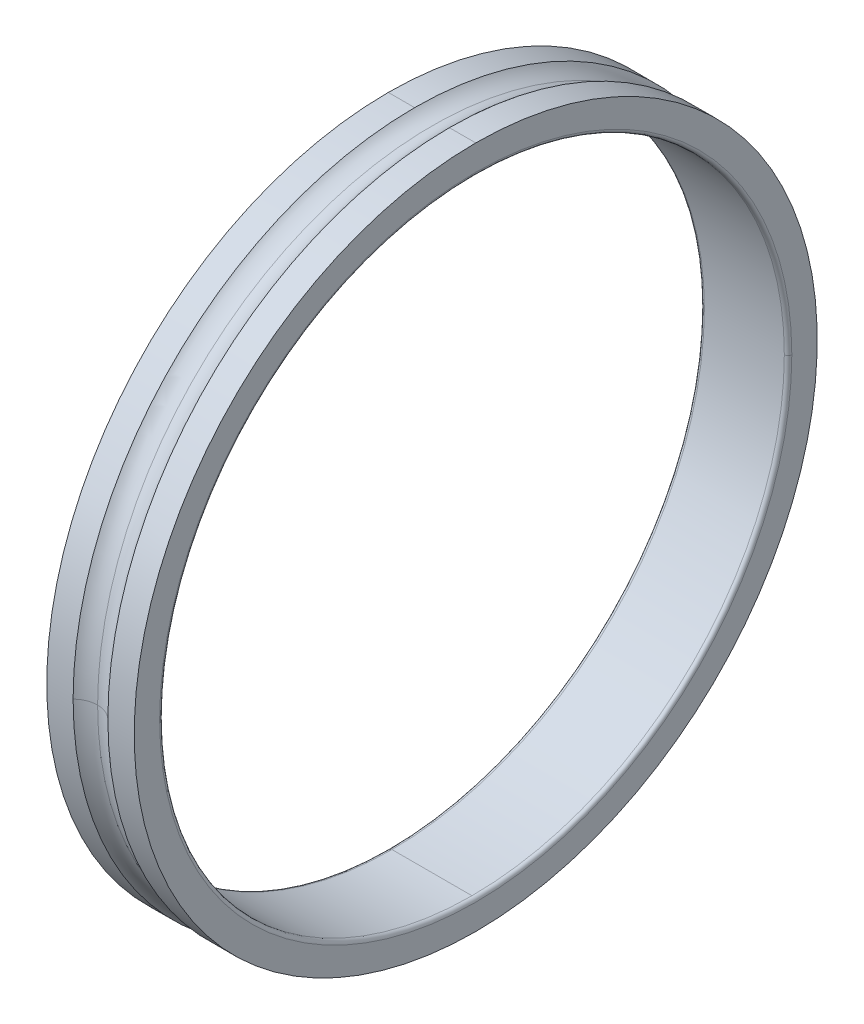
ISO-10303-21;
HEADER;
FILE_DESCRIPTION(('STEP AP214'),'2;1');
FILE_NAME('part.step','',(''),(''),'','','');
FILE_SCHEMA(('AUTOMOTIVE_DESIGN { 1 0 10303 214 1 1 1 1 }'));
ENDSEC;
DATA;
#1=APPLICATION_CONTEXT('core data for automotive mechanical design processes');
#2=APPLICATION_PROTOCOL_DEFINITION('international standard','automotive_design',2000,#1);
#3=PRODUCT_CONTEXT('',#1,'mechanical');
#4=PRODUCT('Part','Part','',(#3));
#5=PRODUCT_RELATED_PRODUCT_CATEGORY('part','',(#4));
#6=PRODUCT_DEFINITION_FORMATION('','',#4);
#7=PRODUCT_DEFINITION_CONTEXT('part definition',#1,'design');
#8=PRODUCT_DEFINITION('design','',#6,#7);
#9=PRODUCT_DEFINITION_SHAPE('','',#8);
#10=(LENGTH_UNIT() NAMED_UNIT(*) SI_UNIT(.MILLI.,.METRE.));
#11=(NAMED_UNIT(*) PLANE_ANGLE_UNIT() SI_UNIT($,.RADIAN.));
#12=(NAMED_UNIT(*) SI_UNIT($,.STERADIAN.) SOLID_ANGLE_UNIT());
#13=UNCERTAINTY_MEASURE_WITH_UNIT(LENGTH_MEASURE(1.E-05),#10,'distance_accuracy_value','');
#14=(GEOMETRIC_REPRESENTATION_CONTEXT(3) GLOBAL_UNCERTAINTY_ASSIGNED_CONTEXT((#13)) GLOBAL_UNIT_ASSIGNED_CONTEXT((#10,
#11,#12)) REPRESENTATION_CONTEXT('',''));
#15=CARTESIAN_POINT('',(0.,0.,0.));
#16=DIRECTION('',(0.,0.,1.));
#17=DIRECTION('',(1.,0.,0.));
#18=AXIS2_PLACEMENT_3D('',#15,#16,#17);
#19=CARTESIAN_POINT('',(5.94570382527338,0.,0.));
#20=DIRECTION('',(1.,0.,0.));
#21=DIRECTION('',(0.,1.,0.));
#22=AXIS2_PLACEMENT_3D('',#19,#20,#21);
#23=CYLINDRICAL_SURFACE('',#22,27.335);
#24=DIRECTION('',(1.,0.,0.));
#25=VECTOR('',#24,1.);
#26=CARTESIAN_POINT('',(5.94570382527338,27.335,0.));
#27=LINE('',#26,#25);
#28=CARTESIAN_POINT('',(4.89140765054676,27.335,0.));
#29=VERTEX_POINT('',#28);
#30=CARTESIAN_POINT('',(7.,27.335,0.));
#31=VERTEX_POINT('',#30);
#32=EDGE_CURVE('E157',#29,#31,#27,.T.);
#33=ORIENTED_EDGE('',*,*,#32,.T.);
#34=CARTESIAN_POINT('',(7.,0.,0.));
#35=DIRECTION('',(1.,0.,0.));
#36=DIRECTION('',(0.,1.,0.));
#37=AXIS2_PLACEMENT_3D('',#34,#35,#36);
#38=CIRCLE('',#37,27.335);
#39=CARTESIAN_POINT('',(7.,-27.335,0.));
#40=VERTEX_POINT('',#39);
#41=EDGE_CURVE('E169',#40,#31,#38,.T.);
#42=ORIENTED_EDGE('',*,*,#41,.F.);
#43=DIRECTION('',(-1.,0.,0.));
#44=VECTOR('',#43,1.);
#45=CARTESIAN_POINT('',(5.94570382527338,-27.335,0.));
#46=LINE('',#45,#44);
#47=CARTESIAN_POINT('',(4.89140765054676,-27.335,0.));
#48=VERTEX_POINT('',#47);
#49=EDGE_CURVE('E163',#40,#48,#46,.T.);
#50=ORIENTED_EDGE('',*,*,#49,.T.);
#51=CARTESIAN_POINT('',(4.89140765054676,0.,0.));
#52=DIRECTION('',(1.,0.,0.));
#53=DIRECTION('',(0.,1.,0.));
#54=AXIS2_PLACEMENT_3D('',#51,#52,#53);
#55=CIRCLE('',#54,27.335);
#56=CARTESIAN_POINT('',(4.89140765054676,0.,-27.335));
#57=VERTEX_POINT('',#56);
#58=EDGE_CURVE('E145',#48,#57,#55,.T.);
#59=ORIENTED_EDGE('',*,*,#58,.T.);
#60=CARTESIAN_POINT('',(4.89140765054676,0.,0.));
#61=DIRECTION('',(1.,0.,0.));
#62=DIRECTION('',(0.,1.,0.));
#63=AXIS2_PLACEMENT_3D('',#60,#61,#62);
#64=CIRCLE('',#63,27.335);
#65=EDGE_CURVE('E154',#57,#29,#64,.T.);
#66=ORIENTED_EDGE('',*,*,#65,.T.);
#67=EDGE_LOOP('',(#33,#42,#50,#59,#66));
#68=FACE_BOUND('',#67,.T.);
#69=ADVANCED_FACE('F17',(#68),#23,.T.);
#70=CARTESIAN_POINT('',(3.5,0.,0.));
#71=DIRECTION('',(1.,0.,0.));
#72=DIRECTION('',(0.,0.,-1.));
#73=AXIS2_PLACEMENT_3D('',#70,#71,#72);
#74=TOROIDAL_SURFACE('',#73,28.75,1.9845);
#75=CARTESIAN_POINT('',(3.5,0.,0.));
#76=DIRECTION('',(-1.,0.,0.));
#77=DIRECTION('',(0.,0.,1.));
#78=AXIS2_PLACEMENT_3D('',#75,#76,#77);
#79=CIRCLE('',#78,26.7655);
#80=CARTESIAN_POINT('',(3.5,0.,26.7655));
#81=VERTEX_POINT('',#80);
#82=CARTESIAN_POINT('',(3.5,0.,-26.7655));
#83=VERTEX_POINT('',#82);
#84=EDGE_CURVE('E133',#81,#83,#79,.T.);
#85=ORIENTED_EDGE('',*,*,#84,.T.);
#86=CARTESIAN_POINT('',(3.5,0.,-28.75));
#87=DIRECTION('',(0.,-1.,0.));
#88=DIRECTION('',(0.,0.,-1.));
#89=AXIS2_PLACEMENT_3D('',#86,#87,#88);
#90=CIRCLE('',#89,1.9845);
#91=CARTESIAN_POINT('',(2.10859234945325,0.,-27.335));
#92=VERTEX_POINT('',#91);
#93=EDGE_CURVE('E127',#83,#92,#90,.T.);
#94=ORIENTED_EDGE('',*,*,#93,.T.);
#95=CARTESIAN_POINT('',(2.10859234945325,0.,0.));
#96=DIRECTION('',(1.,0.,0.));
#97=DIRECTION('',(0.,1.,0.));
#98=AXIS2_PLACEMENT_3D('',#95,#96,#97);
#99=CIRCLE('',#98,27.335);
#100=CARTESIAN_POINT('',(2.10859234945325,27.335,0.));
#101=VERTEX_POINT('',#100);
#102=EDGE_CURVE('E11',#92,#101,#99,.T.);
#103=ORIENTED_EDGE('',*,*,#102,.T.);
#104=CARTESIAN_POINT('',(2.10859234945325,0.,0.));
#105=DIRECTION('',(1.,0.,0.));
#106=DIRECTION('',(0.,1.,0.));
#107=AXIS2_PLACEMENT_3D('',#104,#105,#106);
#108=CIRCLE('',#107,27.335);
#109=CARTESIAN_POINT('',(2.10859234945325,0.,27.335));
#110=VERTEX_POINT('',#109);
#111=EDGE_CURVE('E126',#101,#110,#108,.T.);
#112=ORIENTED_EDGE('',*,*,#111,.T.);
#113=CARTESIAN_POINT('',(3.5,0.,28.75));
#114=DIRECTION('',(0.,-1.,0.));
#115=DIRECTION('',(0.,0.,1.));
#116=AXIS2_PLACEMENT_3D('',#113,#114,#115);
#117=CIRCLE('',#116,1.9845);
#118=EDGE_CURVE('E174',#110,#81,#117,.T.);
#119=ORIENTED_EDGE('',*,*,#118,.T.);
#120=EDGE_LOOP('',(#85,#94,#103,#112,#119));
#121=FACE_BOUND('',#120,.T.);
#122=ADVANCED_FACE('F260',(#121),#74,.F.);
#123=CARTESIAN_POINT('',(1.05429617472663,0.,0.));
#124=DIRECTION('',(1.,0.,0.));
#125=DIRECTION('',(0.,1.,0.));
#126=AXIS2_PLACEMENT_3D('',#123,#124,#125);
#127=CYLINDRICAL_SURFACE('',#126,27.335);
#128=DIRECTION('',(1.,0.,0.));
#129=VECTOR('',#128,1.);
#130=CARTESIAN_POINT('',(1.05429617472663,27.335,0.));
#131=LINE('',#130,#129);
#132=CARTESIAN_POINT('',(0.,27.335,0.));
#133=VERTEX_POINT('',#132);
#134=EDGE_CURVE('E113',#133,#101,#131,.T.);
#135=ORIENTED_EDGE('',*,*,#134,.T.);
#136=ORIENTED_EDGE('',*,*,#102,.F.);
#137=CARTESIAN_POINT('',(2.10859234945325,0.,0.));
#138=DIRECTION('',(1.,0.,0.));
#139=DIRECTION('',(0.,1.,0.));
#140=AXIS2_PLACEMENT_3D('',#137,#138,#139);
#141=CIRCLE('',#140,27.335);
#142=CARTESIAN_POINT('',(2.10859234945325,-27.335,0.));
#143=VERTEX_POINT('',#142);
#144=EDGE_CURVE('E130',#143,#92,#141,.T.);
#145=ORIENTED_EDGE('',*,*,#144,.F.);
#146=DIRECTION('',(-1.,0.,0.));
#147=VECTOR('',#146,1.);
#148=CARTESIAN_POINT('',(1.05429617472663,-27.335,0.));
#149=LINE('',#148,#147);
#150=CARTESIAN_POINT('',(0.,-27.335,0.));
#151=VERTEX_POINT('',#150);
#152=EDGE_CURVE('E115',#143,#151,#149,.T.);
#153=ORIENTED_EDGE('',*,*,#152,.T.);
#154=CARTESIAN_POINT('',(0.,0.,0.));
#155=DIRECTION('',(1.,0.,0.));
#156=DIRECTION('',(0.,1.,0.));
#157=AXIS2_PLACEMENT_3D('',#154,#155,#156);
#158=CIRCLE('',#157,27.335);
#159=EDGE_CURVE('E24',#151,#133,#158,.T.);
#160=ORIENTED_EDGE('',*,*,#159,.T.);
#161=EDGE_LOOP('',(#135,#136,#145,#153,#160));
#162=FACE_BOUND('',#161,.T.);
#163=ADVANCED_FACE('F111',(#162),#127,.T.);
#164=CARTESIAN_POINT('',(0.,26.3175,0.));
#165=DIRECTION('',(-1.,0.,0.));
#166=DIRECTION('',(0.,0.,1.));
#167=AXIS2_PLACEMENT_3D('',#164,#165,#166);
#168=PLANE('',#167);
#169=CARTESIAN_POINT('',(0.,0.,0.));
#170=DIRECTION('',(1.,0.,0.));
#171=DIRECTION('',(0.,1.,0.));
#172=AXIS2_PLACEMENT_3D('',#169,#170,#171);
#173=CIRCLE('',#172,25.3);
#174=CARTESIAN_POINT('',(0.,0.,25.3));
#175=VERTEX_POINT('',#174);
#176=CARTESIAN_POINT('',(0.,0.,-25.3));
#177=VERTEX_POINT('',#176);
#178=EDGE_CURVE('E118',#175,#177,#173,.T.);
#179=ORIENTED_EDGE('',*,*,#178,.T.);
#180=CARTESIAN_POINT('',(0.,0.,0.));
#181=DIRECTION('',(1.,0.,0.));
#182=DIRECTION('',(0.,1.,0.));
#183=AXIS2_PLACEMENT_3D('',#180,#181,#182);
#184=CIRCLE('',#183,25.3);
#185=EDGE_CURVE('E189',#177,#175,#184,.T.);
#186=ORIENTED_EDGE('',*,*,#185,.T.);
#187=EDGE_LOOP('',(#179,#186));
#188=FACE_BOUND('',#187,.T.);
#189=CARTESIAN_POINT('',(0.,0.,0.));
#190=DIRECTION('',(1.,0.,0.));
#191=DIRECTION('',(0.,1.,0.));
#192=AXIS2_PLACEMENT_3D('',#189,#190,#191);
#193=CIRCLE('',#192,27.335);
#194=EDGE_CURVE('E119',#133,#151,#193,.T.);
#195=ORIENTED_EDGE('',*,*,#194,.F.);
#196=ORIENTED_EDGE('',*,*,#159,.F.);
#197=EDGE_LOOP('',(#195,#196));
#198=FACE_BOUND('',#197,.T.);
#199=ADVANCED_FACE('F120',(#188,#198),#168,.T.);
#200=CARTESIAN_POINT('',(0.3,0.,0.));
#201=DIRECTION('',(1.,0.,0.));
#202=DIRECTION('',(0.,0.,-1.));
#203=AXIS2_PLACEMENT_3D('',#200,#201,#202);
#204=TOROIDAL_SURFACE('',#203,25.3,0.3);
#205=CARTESIAN_POINT('',(0.3,0.,-25.3));
#206=DIRECTION('',(0.,-1.,0.));
#207=DIRECTION('',(0.,0.,-1.));
#208=AXIS2_PLACEMENT_3D('',#205,#206,#207);
#209=CIRCLE('',#208,0.3);
#210=CARTESIAN_POINT('',(0.3,0.,-25.));
#211=VERTEX_POINT('',#210);
#212=EDGE_CURVE('E141',#211,#177,#209,.T.);
#213=ORIENTED_EDGE('',*,*,#212,.T.);
#214=ORIENTED_EDGE('',*,*,#178,.F.);
#215=CARTESIAN_POINT('',(0.3,0.,25.3));
#216=DIRECTION('',(0.,-1.,0.));
#217=DIRECTION('',(0.,0.,1.));
#218=AXIS2_PLACEMENT_3D('',#215,#216,#217);
#219=CIRCLE('',#218,0.3);
#220=CARTESIAN_POINT('',(0.3,0.,25.));
#221=VERTEX_POINT('',#220);
#222=EDGE_CURVE('E151',#175,#221,#219,.T.);
#223=ORIENTED_EDGE('',*,*,#222,.T.);
#224=CARTESIAN_POINT('',(0.3,0.,0.));
#225=DIRECTION('',(1.,0.,0.));
#226=DIRECTION('',(0.,1.,0.));
#227=AXIS2_PLACEMENT_3D('',#224,#225,#226);
#228=CIRCLE('',#227,25.);
#229=CARTESIAN_POINT('',(0.3,-25.,0.));
#230=VERTEX_POINT('',#229);
#231=EDGE_CURVE('E181',#221,#230,#228,.T.);
#232=ORIENTED_EDGE('',*,*,#231,.T.);
#233=CARTESIAN_POINT('',(0.3,0.,0.));
#234=DIRECTION('',(1.,0.,0.));
#235=DIRECTION('',(0.,1.,0.));
#236=AXIS2_PLACEMENT_3D('',#233,#234,#235);
#237=CIRCLE('',#236,25.);
#238=EDGE_CURVE('E195',#230,#211,#237,.T.);
#239=ORIENTED_EDGE('',*,*,#238,.T.);
#240=EDGE_LOOP('',(#213,#214,#223,#232,#239));
#241=FACE_BOUND('',#240,.T.);
#242=ADVANCED_FACE('F224',(#241),#204,.T.);
#243=CARTESIAN_POINT('',(3.5,0.,0.));
#244=DIRECTION('',(1.,0.,0.));
#245=DIRECTION('',(0.,1.,0.));
#246=AXIS2_PLACEMENT_3D('',#243,#244,#245);
#247=CYLINDRICAL_SURFACE('',#246,25.);
#248=DIRECTION('',(1.,0.,0.));
#249=VECTOR('',#248,1.);
#250=CARTESIAN_POINT('',(3.5,25.,0.));
#251=LINE('',#250,#249);
#252=CARTESIAN_POINT('',(0.3,25.,0.));
#253=VERTEX_POINT('',#252);
#254=CARTESIAN_POINT('',(6.7,25.,0.));
#255=VERTEX_POINT('',#254);
#256=EDGE_CURVE('E192',#253,#255,#251,.T.);
#257=ORIENTED_EDGE('',*,*,#256,.T.);
#258=CARTESIAN_POINT('',(6.7,0.,0.));
#259=DIRECTION('',(1.,0.,0.));
#260=DIRECTION('',(0.,1.,0.));
#261=AXIS2_PLACEMENT_3D('',#258,#259,#260);
#262=CIRCLE('',#261,25.);
#263=CARTESIAN_POINT('',(6.7,0.,25.));
#264=VERTEX_POINT('',#263);
#265=EDGE_CURVE('E213',#255,#264,#262,.T.);
#266=ORIENTED_EDGE('',*,*,#265,.T.);
#267=CARTESIAN_POINT('',(6.7,0.,0.));
#268=DIRECTION('',(1.,0.,0.));
#269=DIRECTION('',(0.,1.,0.));
#270=AXIS2_PLACEMENT_3D('',#267,#268,#269);
#271=CIRCLE('',#270,25.);
#272=CARTESIAN_POINT('',(6.7,-25.,0.));
#273=VERTEX_POINT('',#272);
#274=EDGE_CURVE('E31',#264,#273,#271,.T.);
#275=ORIENTED_EDGE('',*,*,#274,.T.);
#276=DIRECTION('',(-1.,0.,0.));
#277=VECTOR('',#276,1.);
#278=CARTESIAN_POINT('',(3.5,-25.,0.));
#279=LINE('',#278,#277);
#280=EDGE_CURVE('E197',#273,#230,#279,.T.);
#281=ORIENTED_EDGE('',*,*,#280,.T.);
#282=ORIENTED_EDGE('',*,*,#231,.F.);
#283=CARTESIAN_POINT('',(0.3,0.,0.));
#284=DIRECTION('',(1.,0.,0.));
#285=DIRECTION('',(0.,1.,0.));
#286=AXIS2_PLACEMENT_3D('',#283,#284,#285);
#287=CIRCLE('',#286,25.);
#288=EDGE_CURVE('E140',#253,#221,#287,.T.);
#289=ORIENTED_EDGE('',*,*,#288,.F.);
#290=EDGE_LOOP('',(#257,#266,#275,#281,#282,#289));
#291=FACE_BOUND('',#290,.T.);
#292=ADVANCED_FACE('F232',(#291),#247,.F.);
#293=CARTESIAN_POINT('',(6.7,0.,0.));
#294=DIRECTION('',(1.,0.,0.));
#295=DIRECTION('',(0.,0.,-1.));
#296=AXIS2_PLACEMENT_3D('',#293,#294,#295);
#297=TOROIDAL_SURFACE('',#296,25.3,0.3);
#298=CARTESIAN_POINT('',(6.7,0.,-25.3));
#299=DIRECTION('',(0.,-1.,0.));
#300=DIRECTION('',(0.,0.,-1.));
#301=AXIS2_PLACEMENT_3D('',#298,#299,#300);
#302=CIRCLE('',#301,0.3);
#303=CARTESIAN_POINT('',(7.,0.,-25.3));
#304=VERTEX_POINT('',#303);
#305=CARTESIAN_POINT('',(6.7,0.,-25.));
#306=VERTEX_POINT('',#305);
#307=EDGE_CURVE('E206',#304,#306,#302,.T.);
#308=ORIENTED_EDGE('',*,*,#307,.T.);
#309=CARTESIAN_POINT('',(6.7,0.,0.));
#310=DIRECTION('',(1.,0.,0.));
#311=DIRECTION('',(0.,1.,0.));
#312=AXIS2_PLACEMENT_3D('',#309,#310,#311);
#313=CIRCLE('',#312,25.);
#314=EDGE_CURVE('E200',#273,#306,#313,.T.);
#315=ORIENTED_EDGE('',*,*,#314,.F.);
#316=ORIENTED_EDGE('',*,*,#274,.F.);
#317=CARTESIAN_POINT('',(6.7,0.,25.3));
#318=DIRECTION('',(0.,-1.,0.));
#319=DIRECTION('',(0.,0.,1.));
#320=AXIS2_PLACEMENT_3D('',#317,#318,#319);
#321=CIRCLE('',#320,0.3);
#322=CARTESIAN_POINT('',(7.,0.,25.3));
#323=VERTEX_POINT('',#322);
#324=EDGE_CURVE('E211',#264,#323,#321,.T.);
#325=ORIENTED_EDGE('',*,*,#324,.T.);
#326=CARTESIAN_POINT('',(7.,0.,0.));
#327=DIRECTION('',(1.,0.,0.));
#328=DIRECTION('',(0.,1.,0.));
#329=AXIS2_PLACEMENT_3D('',#326,#327,#328);
#330=CIRCLE('',#329,25.3);
#331=EDGE_CURVE('E38',#323,#304,#330,.T.);
#332=ORIENTED_EDGE('',*,*,#331,.T.);
#333=EDGE_LOOP('',(#308,#315,#316,#325,#332));
#334=FACE_BOUND('',#333,.T.);
#335=ADVANCED_FACE('F234',(#334),#297,.T.);
#336=CARTESIAN_POINT('',(7.,26.3175,0.));
#337=DIRECTION('',(1.,0.,0.));
#338=DIRECTION('',(0.,1.,0.));
#339=AXIS2_PLACEMENT_3D('',#336,#337,#338);
#340=PLANE('',#339);
#341=CARTESIAN_POINT('',(7.,0.,0.));
#342=DIRECTION('',(1.,0.,0.));
#343=DIRECTION('',(0.,1.,0.));
#344=AXIS2_PLACEMENT_3D('',#341,#342,#343);
#345=CIRCLE('',#344,25.3);
#346=EDGE_CURVE('E208',#304,#323,#345,.T.);
#347=ORIENTED_EDGE('',*,*,#346,.F.);
#348=ORIENTED_EDGE('',*,*,#331,.F.);
#349=EDGE_LOOP('',(#347,#348));
#350=FACE_BOUND('',#349,.T.);
#351=CARTESIAN_POINT('',(7.,0.,0.));
#352=DIRECTION('',(1.,0.,0.));
#353=DIRECTION('',(0.,1.,0.));
#354=AXIS2_PLACEMENT_3D('',#351,#352,#353);
#355=CIRCLE('',#354,27.335);
#356=EDGE_CURVE('E165',#31,#40,#355,.T.);
#357=ORIENTED_EDGE('',*,*,#356,.T.);
#358=ORIENTED_EDGE('',*,*,#41,.T.);
#359=EDGE_LOOP('',(#357,#358));
#360=FACE_BOUND('',#359,.T.);
#361=ADVANCED_FACE('F239',(#350,#360),#340,.T.);
#362=CARTESIAN_POINT('',(6.7,0.,0.));
#363=DIRECTION('',(1.,0.,0.));
#364=DIRECTION('',(0.,0.,-1.));
#365=AXIS2_PLACEMENT_3D('',#362,#363,#364);
#366=TOROIDAL_SURFACE('',#365,25.3,0.3);
#367=ORIENTED_EDGE('',*,*,#307,.F.);
#368=ORIENTED_EDGE('',*,*,#346,.T.);
#369=ORIENTED_EDGE('',*,*,#324,.F.);
#370=ORIENTED_EDGE('',*,*,#265,.F.);
#371=CARTESIAN_POINT('',(6.7,0.,0.));
#372=DIRECTION('',(1.,0.,0.));
#373=DIRECTION('',(0.,1.,0.));
#374=AXIS2_PLACEMENT_3D('',#371,#372,#373);
#375=CIRCLE('',#374,25.);
#376=EDGE_CURVE('E203',#306,#255,#375,.T.);
#377=ORIENTED_EDGE('',*,*,#376,.F.);
#378=EDGE_LOOP('',(#367,#368,#369,#370,#377));
#379=FACE_BOUND('',#378,.T.);
#380=ADVANCED_FACE('F237',(#379),#366,.T.);
#381=CARTESIAN_POINT('',(3.5,0.,0.));
#382=DIRECTION('',(1.,0.,0.));
#383=DIRECTION('',(0.,1.,0.));
#384=AXIS2_PLACEMENT_3D('',#381,#382,#383);
#385=CYLINDRICAL_SURFACE('',#384,25.);
#386=ORIENTED_EDGE('',*,*,#256,.F.);
#387=CARTESIAN_POINT('',(0.3,0.,0.));
#388=DIRECTION('',(1.,0.,0.));
#389=DIRECTION('',(0.,1.,0.));
#390=AXIS2_PLACEMENT_3D('',#387,#388,#389);
#391=CIRCLE('',#390,25.);
#392=EDGE_CURVE('E137',#211,#253,#391,.T.);
#393=ORIENTED_EDGE('',*,*,#392,.F.);
#394=ORIENTED_EDGE('',*,*,#238,.F.);
#395=ORIENTED_EDGE('',*,*,#280,.F.);
#396=ORIENTED_EDGE('',*,*,#314,.T.);
#397=ORIENTED_EDGE('',*,*,#376,.T.);
#398=EDGE_LOOP('',(#386,#393,#394,#395,#396,#397));
#399=FACE_BOUND('',#398,.T.);
#400=ADVANCED_FACE('F229',(#399),#385,.F.);
#401=CARTESIAN_POINT('',(0.3,0.,0.));
#402=DIRECTION('',(1.,0.,0.));
#403=DIRECTION('',(0.,0.,-1.));
#404=AXIS2_PLACEMENT_3D('',#401,#402,#403);
#405=TOROIDAL_SURFACE('',#404,25.3,0.3);
#406=ORIENTED_EDGE('',*,*,#212,.F.);
#407=ORIENTED_EDGE('',*,*,#392,.T.);
#408=ORIENTED_EDGE('',*,*,#288,.T.);
#409=ORIENTED_EDGE('',*,*,#222,.F.);
#410=ORIENTED_EDGE('',*,*,#185,.F.);
#411=EDGE_LOOP('',(#406,#407,#408,#409,#410));
#412=FACE_BOUND('',#411,.T.);
#413=ADVANCED_FACE('F223',(#412),#405,.T.);
#414=CARTESIAN_POINT('',(1.05429617472663,0.,0.));
#415=DIRECTION('',(1.,0.,0.));
#416=DIRECTION('',(0.,1.,0.));
#417=AXIS2_PLACEMENT_3D('',#414,#415,#416);
#418=CYLINDRICAL_SURFACE('',#417,27.335);
#419=ORIENTED_EDGE('',*,*,#134,.F.);
#420=ORIENTED_EDGE('',*,*,#194,.T.);
#421=ORIENTED_EDGE('',*,*,#152,.F.);
#422=CARTESIAN_POINT('',(2.10859234945325,0.,0.));
#423=DIRECTION('',(1.,0.,0.));
#424=DIRECTION('',(0.,1.,0.));
#425=AXIS2_PLACEMENT_3D('',#422,#423,#424);
#426=CIRCLE('',#425,27.335);
#427=EDGE_CURVE('E176',#110,#143,#426,.T.);
#428=ORIENTED_EDGE('',*,*,#427,.F.);
#429=ORIENTED_EDGE('',*,*,#111,.F.);
#430=EDGE_LOOP('',(#419,#420,#421,#428,#429));
#431=FACE_BOUND('',#430,.T.);
#432=ADVANCED_FACE('F124',(#431),#418,.T.);
#433=CARTESIAN_POINT('',(3.5,0.,0.));
#434=DIRECTION('',(1.,0.,0.));
#435=DIRECTION('',(0.,0.,-1.));
#436=AXIS2_PLACEMENT_3D('',#433,#434,#435);
#437=TOROIDAL_SURFACE('',#436,28.75,1.9845);
#438=CARTESIAN_POINT('',(3.5,0.,0.));
#439=DIRECTION('',(-1.,0.,0.));
#440=DIRECTION('',(0.,0.,1.));
#441=AXIS2_PLACEMENT_3D('',#438,#439,#440);
#442=CIRCLE('',#441,26.7655);
#443=EDGE_CURVE('E148',#83,#81,#442,.T.);
#444=ORIENTED_EDGE('',*,*,#443,.T.);
#445=ORIENTED_EDGE('',*,*,#118,.F.);
#446=ORIENTED_EDGE('',*,*,#427,.T.);
#447=ORIENTED_EDGE('',*,*,#144,.T.);
#448=ORIENTED_EDGE('',*,*,#93,.F.);
#449=EDGE_LOOP('',(#444,#445,#446,#447,#448));
#450=FACE_BOUND('',#449,.T.);
#451=ADVANCED_FACE('F263',(#450),#437,.F.);
#452=CARTESIAN_POINT('',(5.94570382527338,0.,0.));
#453=DIRECTION('',(1.,0.,0.));
#454=DIRECTION('',(0.,1.,0.));
#455=AXIS2_PLACEMENT_3D('',#452,#453,#454);
#456=CYLINDRICAL_SURFACE('',#455,27.335);
#457=ORIENTED_EDGE('',*,*,#32,.F.);
#458=CARTESIAN_POINT('',(4.89140765054676,0.,0.));
#459=DIRECTION('',(1.,0.,0.));
#460=DIRECTION('',(0.,1.,0.));
#461=AXIS2_PLACEMENT_3D('',#458,#459,#460);
#462=CIRCLE('',#461,27.335);
#463=CARTESIAN_POINT('',(4.89140765054676,0.,27.335));
#464=VERTEX_POINT('',#463);
#465=EDGE_CURVE('E144',#29,#464,#462,.T.);
#466=ORIENTED_EDGE('',*,*,#465,.T.);
#467=CARTESIAN_POINT('',(4.89140765054676,0.,0.));
#468=DIRECTION('',(1.,0.,0.));
#469=DIRECTION('',(0.,1.,0.));
#470=AXIS2_PLACEMENT_3D('',#467,#468,#469);
#471=CIRCLE('',#470,27.335);
#472=EDGE_CURVE('E147',#464,#48,#471,.T.);
#473=ORIENTED_EDGE('',*,*,#472,.T.);
#474=ORIENTED_EDGE('',*,*,#49,.F.);
#475=ORIENTED_EDGE('',*,*,#356,.F.);
#476=EDGE_LOOP('',(#457,#466,#473,#474,#475));
#477=FACE_BOUND('',#476,.T.);
#478=ADVANCED_FACE('F246',(#477),#456,.T.);
#479=CARTESIAN_POINT('',(3.5,0.,0.));
#480=DIRECTION('',(1.,0.,0.));
#481=DIRECTION('',(0.,0.,-1.));
#482=AXIS2_PLACEMENT_3D('',#479,#480,#481);
#483=TOROIDAL_SURFACE('',#482,28.75,1.9845);
#484=ORIENTED_EDGE('',*,*,#443,.F.);
#485=CARTESIAN_POINT('',(3.5,0.,-28.75));
#486=DIRECTION('',(0.,-1.,0.));
#487=DIRECTION('',(0.,0.,-1.));
#488=AXIS2_PLACEMENT_3D('',#485,#486,#487);
#489=CIRCLE('',#488,1.9845);
#490=EDGE_CURVE('E160',#57,#83,#489,.T.);
#491=ORIENTED_EDGE('',*,*,#490,.F.);
#492=ORIENTED_EDGE('',*,*,#58,.F.);
#493=ORIENTED_EDGE('',*,*,#472,.F.);
#494=CARTESIAN_POINT('',(3.5,0.,28.75));
#495=DIRECTION('',(0.,-1.,0.));
#496=DIRECTION('',(0.,0.,1.));
#497=AXIS2_PLACEMENT_3D('',#494,#495,#496);
#498=CIRCLE('',#497,1.9845);
#499=EDGE_CURVE('E136',#81,#464,#498,.T.);
#500=ORIENTED_EDGE('',*,*,#499,.F.);
#501=EDGE_LOOP('',(#484,#491,#492,#493,#500));
#502=FACE_BOUND('',#501,.T.);
#503=ADVANCED_FACE('F258',(#502),#483,.F.);
#504=CARTESIAN_POINT('',(3.5,0.,0.));
#505=DIRECTION('',(1.,0.,0.));
#506=DIRECTION('',(0.,0.,-1.));
#507=AXIS2_PLACEMENT_3D('',#504,#505,#506);
#508=TOROIDAL_SURFACE('',#507,28.75,1.9845);
#509=ORIENTED_EDGE('',*,*,#84,.F.);
#510=ORIENTED_EDGE('',*,*,#499,.T.);
#511=ORIENTED_EDGE('',*,*,#465,.F.);
#512=ORIENTED_EDGE('',*,*,#65,.F.);
#513=ORIENTED_EDGE('',*,*,#490,.T.);
#514=EDGE_LOOP('',(#509,#510,#511,#512,#513));
#515=FACE_BOUND('',#514,.T.);
#516=ADVANCED_FACE('F255',(#515),#508,.F.);
#517=CLOSED_SHELL('',(#69,#122,#163,#199,#242,#292,#335,#361,#380,#400,#413,#432,#451,#478,#503,#516));
#518=MANIFOLD_SOLID_BREP('B1',#517);
#519=ADVANCED_BREP_SHAPE_REPRESENTATION('',(#18,#518),#14);
#520=SHAPE_DEFINITION_REPRESENTATION(#9,#519);
ENDSEC;
END-ISO-10303-21;
